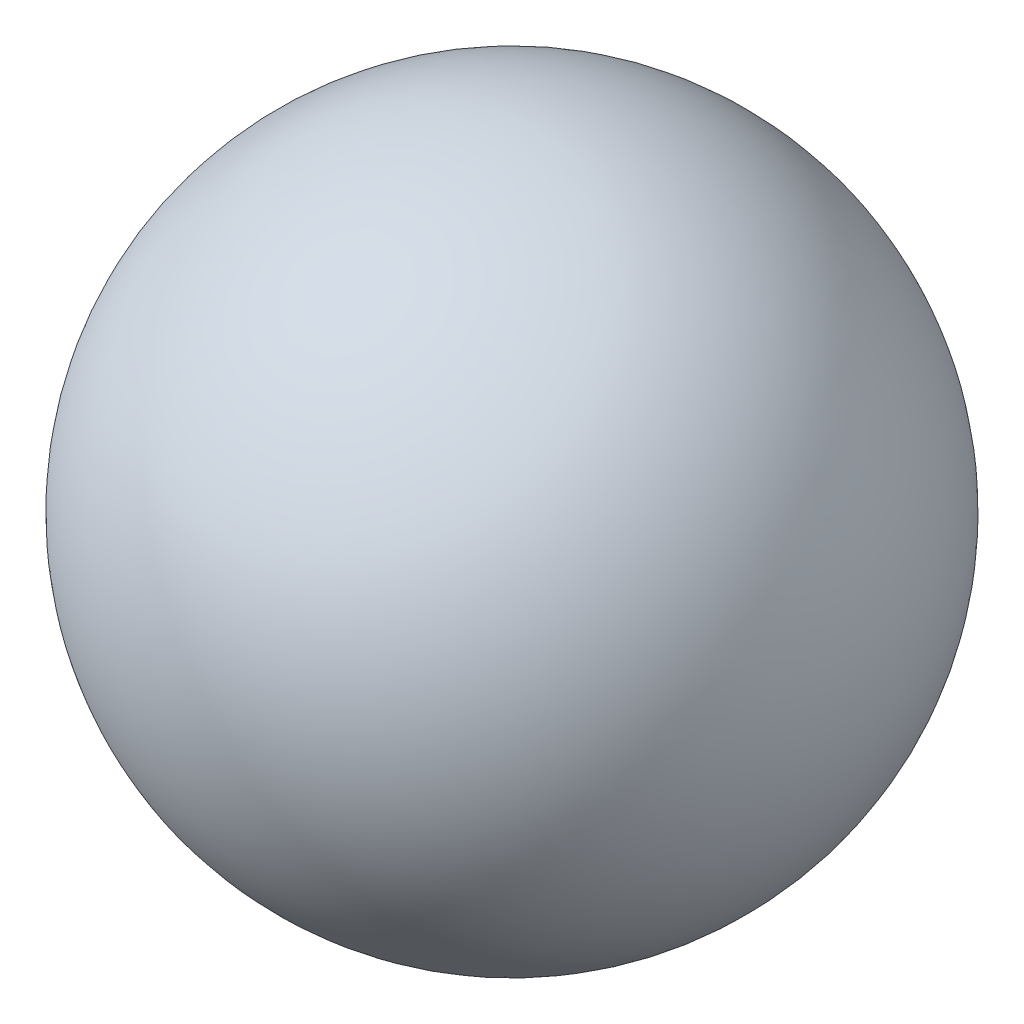
ISO-10303-21;
HEADER;
FILE_DESCRIPTION(('STEP AP214'),'2;1');
FILE_NAME('part.step','',(''),(''),'','','');
FILE_SCHEMA(('AUTOMOTIVE_DESIGN { 1 0 10303 214 1 1 1 1 }'));
ENDSEC;
DATA;
#1=APPLICATION_CONTEXT('core data for automotive mechanical design processes');
#2=APPLICATION_PROTOCOL_DEFINITION('international standard','automotive_design',2000,#1);
#3=PRODUCT_CONTEXT('',#1,'mechanical');
#4=PRODUCT('Part','Part','',(#3));
#5=PRODUCT_RELATED_PRODUCT_CATEGORY('part','',(#4));
#6=PRODUCT_DEFINITION_FORMATION('','',#4);
#7=PRODUCT_DEFINITION_CONTEXT('part definition',#1,'design');
#8=PRODUCT_DEFINITION('design','',#6,#7);
#9=PRODUCT_DEFINITION_SHAPE('','',#8);
#10=(LENGTH_UNIT() NAMED_UNIT(*) SI_UNIT(.MILLI.,.METRE.));
#11=(NAMED_UNIT(*) PLANE_ANGLE_UNIT() SI_UNIT($,.RADIAN.));
#12=(NAMED_UNIT(*) SI_UNIT($,.STERADIAN.) SOLID_ANGLE_UNIT());
#13=UNCERTAINTY_MEASURE_WITH_UNIT(LENGTH_MEASURE(1.E-05),#10,'distance_accuracy_value','');
#14=(GEOMETRIC_REPRESENTATION_CONTEXT(3) GLOBAL_UNCERTAINTY_ASSIGNED_CONTEXT((#13)) GLOBAL_UNIT_ASSIGNED_CONTEXT((#10,
#11,#12)) REPRESENTATION_CONTEXT('',''));
#15=CARTESIAN_POINT('',(0.,0.,0.));
#16=DIRECTION('',(0.,0.,1.));
#17=DIRECTION('',(1.,0.,0.));
#18=AXIS2_PLACEMENT_3D('',#15,#16,#17);
#19=CARTESIAN_POINT('',(0.,0.,0.));
#20=DIRECTION('',(0.,0.,-1.));
#21=DIRECTION('',(1.,0.,0.));
#22=AXIS2_PLACEMENT_3D('',#19,#20,#21);
#23=SPHERICAL_SURFACE('',#22,10.16);
#24=CARTESIAN_POINT('',(0.,0.,-10.16));
#25=VERTEX_POINT('',#24);
#26=VERTEX_LOOP('',#25);
#27=FACE_BOUND('',#26,.T.);
#28=ADVANCED_FACE('F29',(#27),#23,.T.);
#29=CLOSED_SHELL('',(#28));
#30=MANIFOLD_SOLID_BREP('B2',#29);
#31=ADVANCED_BREP_SHAPE_REPRESENTATION('',(#18,#30),#14);
#32=SHAPE_DEFINITION_REPRESENTATION(#9,#31);
ENDSEC;
END-ISO-10303-21;
